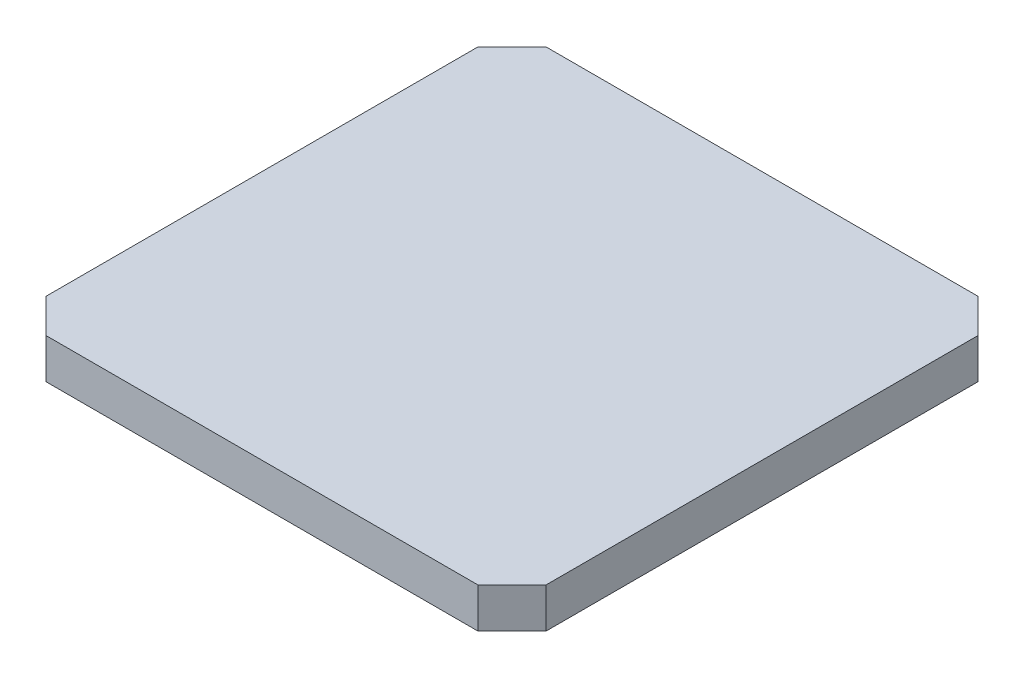
ISO-10303-21;
HEADER;
FILE_DESCRIPTION(('STEP AP214'),'2;1');
FILE_NAME('part.step','',(''),(''),'','','');
FILE_SCHEMA(('AUTOMOTIVE_DESIGN { 1 0 10303 214 1 1 1 1 }'));
ENDSEC;
DATA;
#1=APPLICATION_CONTEXT('core data for automotive mechanical design processes');
#2=APPLICATION_PROTOCOL_DEFINITION('international standard','automotive_design',2000,#1);
#3=PRODUCT_CONTEXT('',#1,'mechanical');
#4=PRODUCT('Part','Part','',(#3));
#5=PRODUCT_RELATED_PRODUCT_CATEGORY('part','',(#4));
#6=PRODUCT_DEFINITION_FORMATION('','',#4);
#7=PRODUCT_DEFINITION_CONTEXT('part definition',#1,'design');
#8=PRODUCT_DEFINITION('design','',#6,#7);
#9=PRODUCT_DEFINITION_SHAPE('','',#8);
#10=(LENGTH_UNIT() NAMED_UNIT(*) SI_UNIT(.MILLI.,.METRE.));
#11=(NAMED_UNIT(*) PLANE_ANGLE_UNIT() SI_UNIT($,.RADIAN.));
#12=(NAMED_UNIT(*) SI_UNIT($,.STERADIAN.) SOLID_ANGLE_UNIT());
#13=UNCERTAINTY_MEASURE_WITH_UNIT(LENGTH_MEASURE(1.E-05),#10,'distance_accuracy_value','');
#14=(GEOMETRIC_REPRESENTATION_CONTEXT(3) GLOBAL_UNCERTAINTY_ASSIGNED_CONTEXT((#13)) GLOBAL_UNIT_ASSIGNED_CONTEXT((#10,
#11,#12)) REPRESENTATION_CONTEXT('',''));
#15=CARTESIAN_POINT('',(0.,0.,0.));
#16=DIRECTION('',(0.,0.,1.));
#17=DIRECTION('',(1.,0.,0.));
#18=AXIS2_PLACEMENT_3D('',#15,#16,#17);
#19=CARTESIAN_POINT('',(1.7,2.,0.));
#20=DIRECTION('',(0.,0.,-1.));
#21=DIRECTION('',(-1.,0.,0.));
#22=AXIS2_PLACEMENT_3D('',#19,#20,#21);
#23=PLANE('',#22);
#24=DIRECTION('',(1.,0.,0.));
#25=VECTOR('',#24,1.);
#26=CARTESIAN_POINT('',(1.7,0.,0.));
#27=LINE('',#26,#25);
#28=CARTESIAN_POINT('',(1.7,0.,0.));
#29=VERTEX_POINT('',#28);
#30=CARTESIAN_POINT('',(23.3,0.,0.));
#31=VERTEX_POINT('',#30);
#32=EDGE_CURVE('E128',#29,#31,#27,.T.);
#33=ORIENTED_EDGE('',*,*,#32,.T.);
#34=DIRECTION('',(0.,-1.,0.));
#35=VECTOR('',#34,1.);
#36=CARTESIAN_POINT('',(23.3,2.,0.));
#37=LINE('',#36,#35);
#38=CARTESIAN_POINT('',(23.3,2.,0.));
#39=VERTEX_POINT('',#38);
#40=EDGE_CURVE('E11',#39,#31,#37,.T.);
#41=ORIENTED_EDGE('',*,*,#40,.F.);
#42=DIRECTION('',(1.,0.,0.));
#43=VECTOR('',#42,1.);
#44=CARTESIAN_POINT('',(1.7,2.,0.));
#45=LINE('',#44,#43);
#46=CARTESIAN_POINT('',(1.7,2.,0.));
#47=VERTEX_POINT('',#46);
#48=EDGE_CURVE('E142',#47,#39,#45,.T.);
#49=ORIENTED_EDGE('',*,*,#48,.F.);
#50=DIRECTION('',(0.,-1.,0.));
#51=VECTOR('',#50,1.);
#52=CARTESIAN_POINT('',(1.7,2.,0.));
#53=LINE('',#52,#51);
#54=EDGE_CURVE('E124',#47,#29,#53,.T.);
#55=ORIENTED_EDGE('',*,*,#54,.T.);
#56=EDGE_LOOP('',(#33,#41,#49,#55));
#57=FACE_BOUND('',#56,.T.);
#58=ADVANCED_FACE('F32',(#57),#23,.F.);
#59=CARTESIAN_POINT('',(23.3,2.,0.));
#60=DIRECTION('',(-0.707106781186548,0.,-0.707106781186548));
#61=DIRECTION('',(-0.707106781186548,0.,0.707106781186547));
#62=AXIS2_PLACEMENT_3D('',#59,#60,#61);
#63=PLANE('',#62);
#64=DIRECTION('',(0.707106781186547,0.,-0.707106781186547));
#65=VECTOR('',#64,1.);
#66=CARTESIAN_POINT('',(23.3,0.,0.));
#67=LINE('',#66,#65);
#68=CARTESIAN_POINT('',(25.,0.,-1.7));
#69=VERTEX_POINT('',#68);
#70=EDGE_CURVE('E131',#31,#69,#67,.T.);
#71=ORIENTED_EDGE('',*,*,#70,.T.);
#72=DIRECTION('',(0.,-1.,0.));
#73=VECTOR('',#72,1.);
#74=CARTESIAN_POINT('',(25.,2.,-1.7));
#75=LINE('',#74,#73);
#76=CARTESIAN_POINT('',(25.,2.,-1.7));
#77=VERTEX_POINT('',#76);
#78=EDGE_CURVE('E40',#77,#69,#75,.T.);
#79=ORIENTED_EDGE('',*,*,#78,.F.);
#80=DIRECTION('',(0.707106781186547,0.,-0.707106781186547));
#81=VECTOR('',#80,1.);
#82=CARTESIAN_POINT('',(23.3,2.,0.));
#83=LINE('',#82,#81);
#84=EDGE_CURVE('E91',#39,#77,#83,.T.);
#85=ORIENTED_EDGE('',*,*,#84,.F.);
#86=ORIENTED_EDGE('',*,*,#40,.T.);
#87=EDGE_LOOP('',(#71,#79,#85,#86));
#88=FACE_BOUND('',#87,.T.);
#89=ADVANCED_FACE('F177',(#88),#63,.F.);
#90=CARTESIAN_POINT('',(25.,2.,-1.7));
#91=DIRECTION('',(-1.,0.,0.));
#92=DIRECTION('',(0.,0.,1.));
#93=AXIS2_PLACEMENT_3D('',#90,#91,#92);
#94=PLANE('',#93);
#95=DIRECTION('',(0.,0.,-1.));
#96=VECTOR('',#95,1.);
#97=CARTESIAN_POINT('',(25.,0.,-1.7));
#98=LINE('',#97,#96);
#99=CARTESIAN_POINT('',(25.,0.,-23.3));
#100=VERTEX_POINT('',#99);
#101=EDGE_CURVE('E133',#69,#100,#98,.T.);
#102=ORIENTED_EDGE('',*,*,#101,.T.);
#103=DIRECTION('',(0.,-1.,0.));
#104=VECTOR('',#103,1.);
#105=CARTESIAN_POINT('',(25.,2.,-23.3));
#106=LINE('',#105,#104);
#107=CARTESIAN_POINT('',(25.,2.,-23.3));
#108=VERTEX_POINT('',#107);
#109=EDGE_CURVE('E149',#108,#100,#106,.T.);
#110=ORIENTED_EDGE('',*,*,#109,.F.);
#111=DIRECTION('',(0.,0.,-1.));
#112=VECTOR('',#111,1.);
#113=CARTESIAN_POINT('',(25.,2.,-1.7));
#114=LINE('',#113,#112);
#115=EDGE_CURVE('E157',#77,#108,#114,.T.);
#116=ORIENTED_EDGE('',*,*,#115,.F.);
#117=ORIENTED_EDGE('',*,*,#78,.T.);
#118=EDGE_LOOP('',(#102,#110,#116,#117));
#119=FACE_BOUND('',#118,.T.);
#120=ADVANCED_FACE('F155',(#119),#94,.F.);
#121=CARTESIAN_POINT('',(23.3,2.,-25.));
#122=DIRECTION('',(-0.707106781186547,0.,0.707106781186547));
#123=DIRECTION('',(0.707106781186548,0.,0.707106781186548));
#124=AXIS2_PLACEMENT_3D('',#121,#122,#123);
#125=PLANE('',#124);
#126=DIRECTION('',(-0.707106781186547,0.,-0.707106781186547));
#127=VECTOR('',#126,1.);
#128=CARTESIAN_POINT('',(23.3,0.,-25.));
#129=LINE('',#128,#127);
#130=CARTESIAN_POINT('',(23.3,0.,-25.));
#131=VERTEX_POINT('',#130);
#132=EDGE_CURVE('E135',#100,#131,#129,.T.);
#133=ORIENTED_EDGE('',*,*,#132,.T.);
#134=DIRECTION('',(0.,-1.,0.));
#135=VECTOR('',#134,1.);
#136=CARTESIAN_POINT('',(23.3,2.,-25.));
#137=LINE('',#136,#135);
#138=CARTESIAN_POINT('',(23.3,2.,-25.));
#139=VERTEX_POINT('',#138);
#140=EDGE_CURVE('E146',#139,#131,#137,.T.);
#141=ORIENTED_EDGE('',*,*,#140,.F.);
#142=DIRECTION('',(-0.707106781186547,0.,-0.707106781186547));
#143=VECTOR('',#142,1.);
#144=CARTESIAN_POINT('',(23.3,2.,-25.));
#145=LINE('',#144,#143);
#146=EDGE_CURVE('E169',#108,#139,#145,.T.);
#147=ORIENTED_EDGE('',*,*,#146,.F.);
#148=ORIENTED_EDGE('',*,*,#109,.T.);
#149=EDGE_LOOP('',(#133,#141,#147,#148));
#150=FACE_BOUND('',#149,.T.);
#151=ADVANCED_FACE('F165',(#150),#125,.F.);
#152=CARTESIAN_POINT('',(1.7,2.,-25.));
#153=DIRECTION('',(0.,0.,1.));
#154=DIRECTION('',(1.,0.,0.));
#155=AXIS2_PLACEMENT_3D('',#152,#153,#154);
#156=PLANE('',#155);
#157=DIRECTION('',(-1.,0.,0.));
#158=VECTOR('',#157,1.);
#159=CARTESIAN_POINT('',(1.7,0.,-25.));
#160=LINE('',#159,#158);
#161=CARTESIAN_POINT('',(1.7,0.,-25.));
#162=VERTEX_POINT('',#161);
#163=EDGE_CURVE('E137',#131,#162,#160,.T.);
#164=ORIENTED_EDGE('',*,*,#163,.T.);
#165=DIRECTION('',(0.,-1.,0.));
#166=VECTOR('',#165,1.);
#167=CARTESIAN_POINT('',(1.7,2.,-25.));
#168=LINE('',#167,#166);
#169=CARTESIAN_POINT('',(1.7,2.,-25.));
#170=VERTEX_POINT('',#169);
#171=EDGE_CURVE('E119',#170,#162,#168,.T.);
#172=ORIENTED_EDGE('',*,*,#171,.F.);
#173=DIRECTION('',(-1.,0.,0.));
#174=VECTOR('',#173,1.);
#175=CARTESIAN_POINT('',(1.7,2.,-25.));
#176=LINE('',#175,#174);
#177=EDGE_CURVE('E110',#139,#170,#176,.T.);
#178=ORIENTED_EDGE('',*,*,#177,.F.);
#179=ORIENTED_EDGE('',*,*,#140,.T.);
#180=EDGE_LOOP('',(#164,#172,#178,#179));
#181=FACE_BOUND('',#180,.T.);
#182=ADVANCED_FACE('F168',(#181),#156,.F.);
#183=CARTESIAN_POINT('',(0.,2.,-23.3));
#184=DIRECTION('',(0.707106781186548,0.,0.707106781186548));
#185=DIRECTION('',(0.707106781186547,0.,-0.707106781186548));
#186=AXIS2_PLACEMENT_3D('',#183,#184,#185);
#187=PLANE('',#186);
#188=DIRECTION('',(-0.707106781186547,0.,0.707106781186547));
#189=VECTOR('',#188,1.);
#190=CARTESIAN_POINT('',(0.,0.,-23.3));
#191=LINE('',#190,#189);
#192=CARTESIAN_POINT('',(0.,0.,-23.3));
#193=VERTEX_POINT('',#192);
#194=EDGE_CURVE('E118',#162,#193,#191,.T.);
#195=ORIENTED_EDGE('',*,*,#194,.T.);
#196=DIRECTION('',(0.,-1.,0.));
#197=VECTOR('',#196,1.);
#198=CARTESIAN_POINT('',(0.,2.,-23.3));
#199=LINE('',#198,#197);
#200=CARTESIAN_POINT('',(0.,2.,-23.3));
#201=VERTEX_POINT('',#200);
#202=EDGE_CURVE('E115',#201,#193,#199,.T.);
#203=ORIENTED_EDGE('',*,*,#202,.F.);
#204=DIRECTION('',(-0.707106781186547,0.,0.707106781186547));
#205=VECTOR('',#204,1.);
#206=CARTESIAN_POINT('',(0.,2.,-23.3));
#207=LINE('',#206,#205);
#208=EDGE_CURVE('E104',#170,#201,#207,.T.);
#209=ORIENTED_EDGE('',*,*,#208,.F.);
#210=ORIENTED_EDGE('',*,*,#171,.T.);
#211=EDGE_LOOP('',(#195,#203,#209,#210));
#212=FACE_BOUND('',#211,.T.);
#213=ADVANCED_FACE('F116',(#212),#187,.F.);
#214=CARTESIAN_POINT('',(0.,2.,-1.7));
#215=DIRECTION('',(1.,0.,0.));
#216=DIRECTION('',(0.,0.,-1.));
#217=AXIS2_PLACEMENT_3D('',#214,#215,#216);
#218=PLANE('',#217);
#219=DIRECTION('',(0.,0.,1.));
#220=VECTOR('',#219,1.);
#221=CARTESIAN_POINT('',(0.,0.,-1.7));
#222=LINE('',#221,#220);
#223=CARTESIAN_POINT('',(0.,0.,-1.7));
#224=VERTEX_POINT('',#223);
#225=EDGE_CURVE('E77',#193,#224,#222,.T.);
#226=ORIENTED_EDGE('',*,*,#225,.T.);
#227=DIRECTION('',(0.,-1.,0.));
#228=VECTOR('',#227,1.);
#229=CARTESIAN_POINT('',(0.,2.,-1.7));
#230=LINE('',#229,#228);
#231=CARTESIAN_POINT('',(0.,2.,-1.7));
#232=VERTEX_POINT('',#231);
#233=EDGE_CURVE('E120',#232,#224,#230,.T.);
#234=ORIENTED_EDGE('',*,*,#233,.F.);
#235=DIRECTION('',(0.,0.,1.));
#236=VECTOR('',#235,1.);
#237=CARTESIAN_POINT('',(0.,2.,-1.7));
#238=LINE('',#237,#236);
#239=EDGE_CURVE('E108',#201,#232,#238,.T.);
#240=ORIENTED_EDGE('',*,*,#239,.F.);
#241=ORIENTED_EDGE('',*,*,#202,.T.);
#242=EDGE_LOOP('',(#226,#234,#240,#241));
#243=FACE_BOUND('',#242,.T.);
#244=ADVANCED_FACE('F122',(#243),#218,.F.);
#245=CARTESIAN_POINT('',(0.,2.,-1.7));
#246=DIRECTION('',(0.707106781186547,0.,-0.707106781186547));
#247=DIRECTION('',(-0.707106781186548,0.,-0.707106781186548));
#248=AXIS2_PLACEMENT_3D('',#245,#246,#247);
#249=PLANE('',#248);
#250=DIRECTION('',(0.707106781186547,0.,0.707106781186547));
#251=VECTOR('',#250,1.);
#252=CARTESIAN_POINT('',(0.,0.,-1.7));
#253=LINE('',#252,#251);
#254=EDGE_CURVE('E83',#224,#29,#253,.T.);
#255=ORIENTED_EDGE('',*,*,#254,.T.);
#256=ORIENTED_EDGE('',*,*,#54,.F.);
#257=DIRECTION('',(0.707106781186547,0.,0.707106781186547));
#258=VECTOR('',#257,1.);
#259=CARTESIAN_POINT('',(0.,2.,-1.7));
#260=LINE('',#259,#258);
#261=EDGE_CURVE('E48',#232,#47,#260,.T.);
#262=ORIENTED_EDGE('',*,*,#261,.F.);
#263=ORIENTED_EDGE('',*,*,#233,.T.);
#264=EDGE_LOOP('',(#255,#256,#262,#263));
#265=FACE_BOUND('',#264,.T.);
#266=ADVANCED_FACE('F193',(#265),#249,.F.);
#267=CARTESIAN_POINT('',(25.,2.,0.));
#268=DIRECTION('',(0.,1.,0.));
#269=DIRECTION('',(0.,0.,1.));
#270=AXIS2_PLACEMENT_3D('',#267,#268,#269);
#271=PLANE('',#270);
#272=ORIENTED_EDGE('',*,*,#48,.T.);
#273=ORIENTED_EDGE('',*,*,#84,.T.);
#274=ORIENTED_EDGE('',*,*,#115,.T.);
#275=ORIENTED_EDGE('',*,*,#146,.T.);
#276=ORIENTED_EDGE('',*,*,#177,.T.);
#277=ORIENTED_EDGE('',*,*,#208,.T.);
#278=ORIENTED_EDGE('',*,*,#239,.T.);
#279=ORIENTED_EDGE('',*,*,#261,.T.);
#280=EDGE_LOOP('',(#272,#273,#274,#275,#276,#277,#278,#279));
#281=FACE_BOUND('',#280,.T.);
#282=ADVANCED_FACE('F106',(#281),#271,.T.);
#283=CARTESIAN_POINT('',(25.,0.,0.));
#284=DIRECTION('',(0.,1.,0.));
#285=DIRECTION('',(0.,0.,1.));
#286=AXIS2_PLACEMENT_3D('',#283,#284,#285);
#287=PLANE('',#286);
#288=ORIENTED_EDGE('',*,*,#32,.F.);
#289=ORIENTED_EDGE('',*,*,#254,.F.);
#290=ORIENTED_EDGE('',*,*,#225,.F.);
#291=ORIENTED_EDGE('',*,*,#194,.F.);
#292=ORIENTED_EDGE('',*,*,#163,.F.);
#293=ORIENTED_EDGE('',*,*,#132,.F.);
#294=ORIENTED_EDGE('',*,*,#101,.F.);
#295=ORIENTED_EDGE('',*,*,#70,.F.);
#296=EDGE_LOOP('',(#288,#289,#290,#291,#292,#293,#294,#295));
#297=FACE_BOUND('',#296,.T.);
#298=ADVANCED_FACE('F161',(#297),#287,.F.);
#299=CLOSED_SHELL('',(#58,#89,#120,#151,#182,#213,#244,#266,#282,#298));
#300=MANIFOLD_SOLID_BREP('B2',#299);
#301=ADVANCED_BREP_SHAPE_REPRESENTATION('',(#18,#300),#14);
#302=SHAPE_DEFINITION_REPRESENTATION(#9,#301);
ENDSEC;
END-ISO-10303-21;
